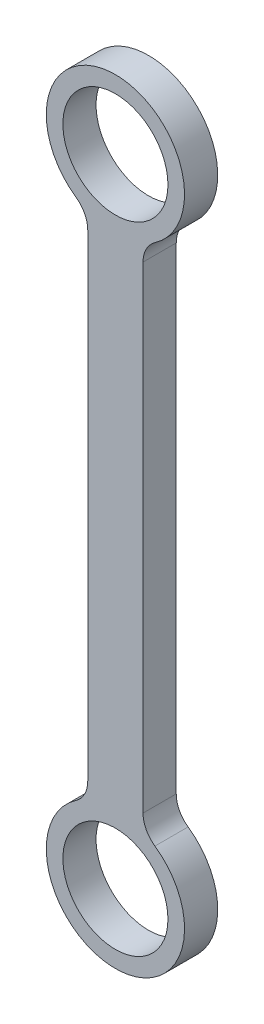
ISO-10303-21;
HEADER;
FILE_DESCRIPTION(('STEP AP214'),'2;1');
FILE_NAME('part.step','',(''),(''),'','','');
FILE_SCHEMA(('AUTOMOTIVE_DESIGN { 1 0 10303 214 1 1 1 1 }'));
ENDSEC;
DATA;
#1=APPLICATION_CONTEXT('core data for automotive mechanical design processes');
#2=APPLICATION_PROTOCOL_DEFINITION('international standard','automotive_design',2000,#1);
#3=PRODUCT_CONTEXT('',#1,'mechanical');
#4=PRODUCT('Part','Part','',(#3));
#5=PRODUCT_RELATED_PRODUCT_CATEGORY('part','',(#4));
#6=PRODUCT_DEFINITION_FORMATION('','',#4);
#7=PRODUCT_DEFINITION_CONTEXT('part definition',#1,'design');
#8=PRODUCT_DEFINITION('design','',#6,#7);
#9=PRODUCT_DEFINITION_SHAPE('','',#8);
#10=(LENGTH_UNIT() NAMED_UNIT(*) SI_UNIT(.MILLI.,.METRE.));
#11=(NAMED_UNIT(*) PLANE_ANGLE_UNIT() SI_UNIT($,.RADIAN.));
#12=(NAMED_UNIT(*) SI_UNIT($,.STERADIAN.) SOLID_ANGLE_UNIT());
#13=UNCERTAINTY_MEASURE_WITH_UNIT(LENGTH_MEASURE(1.E-05),#10,'distance_accuracy_value','');
#14=(GEOMETRIC_REPRESENTATION_CONTEXT(3) GLOBAL_UNCERTAINTY_ASSIGNED_CONTEXT((#13)) GLOBAL_UNIT_ASSIGNED_CONTEXT((#10,
#11,#12)) REPRESENTATION_CONTEXT('',''));
#15=CARTESIAN_POINT('',(0.,0.,0.));
#16=DIRECTION('',(0.,0.,1.));
#17=DIRECTION('',(1.,0.,0.));
#18=AXIS2_PLACEMENT_3D('',#15,#16,#17);
#19=CARTESIAN_POINT('',(0.,0.,6.));
#20=DIRECTION('',(0.,0.,-1.));
#21=DIRECTION('',(-1.,0.,0.));
#22=AXIS2_PLACEMENT_3D('',#19,#20,#21);
#23=CYLINDRICAL_SURFACE('',#22,12.5);
#24=CARTESIAN_POINT('',(0.,0.,0.));
#25=DIRECTION('',(0.,0.,1.));
#26=DIRECTION('',(1.,0.,0.));
#27=AXIS2_PLACEMENT_3D('',#24,#25,#26);
#28=CIRCLE('',#27,12.5);
#29=CARTESIAN_POINT('',(-7.14285714285714,10.2581475831036,0.));
#30=VERTEX_POINT('',#29);
#31=CARTESIAN_POINT('',(7.14285714285714,10.2581475831036,0.));
#32=VERTEX_POINT('',#31);
#33=EDGE_CURVE('E126',#30,#32,#28,.T.);
#34=ORIENTED_EDGE('',*,*,#33,.T.);
#35=DIRECTION('',(0.,0.,-1.));
#36=VECTOR('',#35,1.);
#37=CARTESIAN_POINT('',(7.14285714285714,10.2581475831036,6.));
#38=LINE('',#37,#36);
#39=CARTESIAN_POINT('',(7.14285714285714,10.2581475831036,6.));
#40=VERTEX_POINT('',#39);
#41=EDGE_CURVE('E105',#32,#40,#38,.F.);
#42=ORIENTED_EDGE('',*,*,#41,.T.);
#43=CARTESIAN_POINT('',(0.,0.,6.));
#44=DIRECTION('',(0.,0.,1.));
#45=DIRECTION('',(1.,0.,0.));
#46=AXIS2_PLACEMENT_3D('',#43,#44,#45);
#47=CIRCLE('',#46,12.5);
#48=CARTESIAN_POINT('',(-7.14285714285714,10.2581475831036,6.));
#49=VERTEX_POINT('',#48);
#50=EDGE_CURVE('E141',#49,#40,#47,.T.);
#51=ORIENTED_EDGE('',*,*,#50,.F.);
#52=DIRECTION('',(0.,0.,-1.));
#53=VECTOR('',#52,1.);
#54=CARTESIAN_POINT('',(-7.14285714285714,10.2581475831036,6.));
#55=LINE('',#54,#53);
#56=EDGE_CURVE('E119',#49,#30,#55,.T.);
#57=ORIENTED_EDGE('',*,*,#56,.T.);
#58=EDGE_LOOP('',(#34,#42,#51,#57));
#59=FACE_BOUND('',#58,.T.);
#60=ADVANCED_FACE('F35',(#59),#23,.T.);
#61=CARTESIAN_POINT('',(5.,0.,6.));
#62=DIRECTION('',(-1.,0.,0.));
#63=DIRECTION('',(0.,0.,1.));
#64=AXIS2_PLACEMENT_3D('',#61,#62,#63);
#65=PLANE('',#64);
#66=DIRECTION('',(0.,1.,0.));
#67=VECTOR('',#66,1.);
#68=CARTESIAN_POINT('',(5.,0.,6.));
#69=LINE('',#68,#67);
#70=CARTESIAN_POINT('',(5.,14.3614066163451,6.));
#71=VERTEX_POINT('',#70);
#72=CARTESIAN_POINT('',(5.,100.638593383655,6.));
#73=VERTEX_POINT('',#72);
#74=EDGE_CURVE('E118',#71,#73,#69,.T.);
#75=ORIENTED_EDGE('',*,*,#74,.F.);
#76=DIRECTION('',(0.,0.,1.));
#77=VECTOR('',#76,1.);
#78=CARTESIAN_POINT('',(5.,14.3614066163451,0.));
#79=LINE('',#78,#77);
#80=CARTESIAN_POINT('',(5.,14.3614066163451,0.));
#81=VERTEX_POINT('',#80);
#82=EDGE_CURVE('E104',#71,#81,#79,.F.);
#83=ORIENTED_EDGE('',*,*,#82,.T.);
#84=DIRECTION('',(0.,1.,0.));
#85=VECTOR('',#84,1.);
#86=CARTESIAN_POINT('',(5.,0.,0.));
#87=LINE('',#86,#85);
#88=CARTESIAN_POINT('',(5.,100.638593383655,0.));
#89=VERTEX_POINT('',#88);
#90=EDGE_CURVE('E116',#81,#89,#87,.T.);
#91=ORIENTED_EDGE('',*,*,#90,.T.);
#92=DIRECTION('',(0.,0.,1.));
#93=VECTOR('',#92,1.);
#94=CARTESIAN_POINT('',(5.,100.638593383655,6.));
#95=LINE('',#94,#93);
#96=EDGE_CURVE('E120',#89,#73,#95,.T.);
#97=ORIENTED_EDGE('',*,*,#96,.T.);
#98=EDGE_LOOP('',(#75,#83,#91,#97));
#99=FACE_BOUND('',#98,.T.);
#100=ADVANCED_FACE('F115',(#99),#65,.F.);
#101=CARTESIAN_POINT('',(0.,115.,6.));
#102=DIRECTION('',(0.,0.,-1.));
#103=DIRECTION('',(-1.,0.,0.));
#104=AXIS2_PLACEMENT_3D('',#101,#102,#103);
#105=CYLINDRICAL_SURFACE('',#104,12.5);
#106=CARTESIAN_POINT('',(0.,115.,0.));
#107=DIRECTION('',(0.,0.,1.));
#108=DIRECTION('',(1.,0.,0.));
#109=AXIS2_PLACEMENT_3D('',#106,#107,#108);
#110=CIRCLE('',#109,12.5);
#111=CARTESIAN_POINT('',(7.14285714285715,104.741852416896,0.));
#112=VERTEX_POINT('',#111);
#113=CARTESIAN_POINT('',(-7.14285714285715,104.741852416896,0.));
#114=VERTEX_POINT('',#113);
#115=EDGE_CURVE('E125',#112,#114,#110,.T.);
#116=ORIENTED_EDGE('',*,*,#115,.T.);
#117=DIRECTION('',(0.,0.,-1.));
#118=VECTOR('',#117,1.);
#119=CARTESIAN_POINT('',(-7.14285714285714,104.741852416896,6.));
#120=LINE('',#119,#118);
#121=CARTESIAN_POINT('',(-7.14285714285715,104.741852416896,6.));
#122=VERTEX_POINT('',#121);
#123=EDGE_CURVE('E50',#114,#122,#120,.F.);
#124=ORIENTED_EDGE('',*,*,#123,.T.);
#125=CARTESIAN_POINT('',(0.,115.,6.));
#126=DIRECTION('',(0.,0.,1.));
#127=DIRECTION('',(1.,0.,0.));
#128=AXIS2_PLACEMENT_3D('',#125,#126,#127);
#129=CIRCLE('',#128,12.5);
#130=CARTESIAN_POINT('',(7.14285714285715,104.741852416896,6.));
#131=VERTEX_POINT('',#130);
#132=EDGE_CURVE('E171',#131,#122,#129,.T.);
#133=ORIENTED_EDGE('',*,*,#132,.F.);
#134=DIRECTION('',(0.,0.,-1.));
#135=VECTOR('',#134,1.);
#136=CARTESIAN_POINT('',(7.14285714285715,104.741852416896,6.));
#137=LINE('',#136,#135);
#138=EDGE_CURVE('E152',#131,#112,#137,.T.);
#139=ORIENTED_EDGE('',*,*,#138,.T.);
#140=EDGE_LOOP('',(#116,#124,#133,#139));
#141=FACE_BOUND('',#140,.T.);
#142=ADVANCED_FACE('F181',(#141),#105,.T.);
#143=CARTESIAN_POINT('',(0.,115.,6.));
#144=DIRECTION('',(0.,0.,-1.));
#145=DIRECTION('',(-1.,0.,0.));
#146=AXIS2_PLACEMENT_3D('',#143,#144,#145);
#147=CYLINDRICAL_SURFACE('',#146,9.5);
#148=CARTESIAN_POINT('',(0.,115.,6.));
#149=DIRECTION('',(0.,0.,1.));
#150=DIRECTION('',(1.,0.,0.));
#151=AXIS2_PLACEMENT_3D('',#148,#149,#150);
#152=CIRCLE('',#151,9.5);
#153=CARTESIAN_POINT('',(9.5,115.,6.));
#154=VERTEX_POINT('',#153);
#155=EDGE_CURVE('E178',#154,#154,#152,.T.);
#156=ORIENTED_EDGE('',*,*,#155,.T.);
#157=EDGE_LOOP('',(#156));
#158=FACE_BOUND('',#157,.T.);
#159=CARTESIAN_POINT('',(0.,115.,0.));
#160=DIRECTION('',(0.,0.,1.));
#161=DIRECTION('',(1.,0.,0.));
#162=AXIS2_PLACEMENT_3D('',#159,#160,#161);
#163=CIRCLE('',#162,9.5);
#164=CARTESIAN_POINT('',(9.5,115.,0.));
#165=VERTEX_POINT('',#164);
#166=EDGE_CURVE('E135',#165,#165,#163,.T.);
#167=ORIENTED_EDGE('',*,*,#166,.F.);
#168=EDGE_LOOP('',(#167));
#169=FACE_BOUND('',#168,.T.);
#170=ADVANCED_FACE('F262',(#158,#169),#147,.F.);
#171=CARTESIAN_POINT('',(-5.,0.,6.));
#172=DIRECTION('',(-1.,0.,0.));
#173=DIRECTION('',(0.,0.,1.));
#174=AXIS2_PLACEMENT_3D('',#171,#172,#173);
#175=PLANE('',#174);
#176=DIRECTION('',(0.,1.,0.));
#177=VECTOR('',#176,1.);
#178=CARTESIAN_POINT('',(-5.,0.,0.));
#179=LINE('',#178,#177);
#180=CARTESIAN_POINT('',(-5.,14.3614066163451,0.));
#181=VERTEX_POINT('',#180);
#182=CARTESIAN_POINT('',(-5.,100.638593383655,0.));
#183=VERTEX_POINT('',#182);
#184=EDGE_CURVE('E128',#181,#183,#179,.T.);
#185=ORIENTED_EDGE('',*,*,#184,.F.);
#186=DIRECTION('',(0.,0.,-1.));
#187=VECTOR('',#186,1.);
#188=CARTESIAN_POINT('',(-5.,14.3614066163451,6.));
#189=LINE('',#188,#187);
#190=CARTESIAN_POINT('',(-5.,14.3614066163451,6.));
#191=VERTEX_POINT('',#190);
#192=EDGE_CURVE('E150',#181,#191,#189,.F.);
#193=ORIENTED_EDGE('',*,*,#192,.T.);
#194=DIRECTION('',(0.,1.,0.));
#195=VECTOR('',#194,1.);
#196=CARTESIAN_POINT('',(-5.,0.,6.));
#197=LINE('',#196,#195);
#198=CARTESIAN_POINT('',(-5.,100.638593383655,6.));
#199=VERTEX_POINT('',#198);
#200=EDGE_CURVE('E169',#191,#199,#197,.T.);
#201=ORIENTED_EDGE('',*,*,#200,.T.);
#202=DIRECTION('',(0.,0.,-1.));
#203=VECTOR('',#202,1.);
#204=CARTESIAN_POINT('',(-5.,100.638593383655,6.));
#205=LINE('',#204,#203);
#206=EDGE_CURVE('E147',#199,#183,#205,.T.);
#207=ORIENTED_EDGE('',*,*,#206,.T.);
#208=EDGE_LOOP('',(#185,#193,#201,#207));
#209=FACE_BOUND('',#208,.T.);
#210=ADVANCED_FACE('F176',(#209),#175,.T.);
#211=CARTESIAN_POINT('',(0.,0.,6.));
#212=DIRECTION('',(0.,0.,-1.));
#213=DIRECTION('',(-1.,0.,0.));
#214=AXIS2_PLACEMENT_3D('',#211,#212,#213);
#215=CYLINDRICAL_SURFACE('',#214,9.5);
#216=CARTESIAN_POINT('',(0.,0.,6.));
#217=DIRECTION('',(0.,0.,1.));
#218=DIRECTION('',(1.,0.,0.));
#219=AXIS2_PLACEMENT_3D('',#216,#217,#218);
#220=CIRCLE('',#219,9.5);
#221=CARTESIAN_POINT('',(9.5,0.,6.));
#222=VERTEX_POINT('',#221);
#223=EDGE_CURVE('E142',#222,#222,#220,.T.);
#224=ORIENTED_EDGE('',*,*,#223,.T.);
#225=EDGE_LOOP('',(#224));
#226=FACE_BOUND('',#225,.T.);
#227=CARTESIAN_POINT('',(0.,0.,0.));
#228=DIRECTION('',(0.,0.,1.));
#229=DIRECTION('',(1.,0.,0.));
#230=AXIS2_PLACEMENT_3D('',#227,#228,#229);
#231=CIRCLE('',#230,9.5);
#232=CARTESIAN_POINT('',(9.5,0.,0.));
#233=VERTEX_POINT('',#232);
#234=EDGE_CURVE('E138',#233,#233,#231,.T.);
#235=ORIENTED_EDGE('',*,*,#234,.F.);
#236=EDGE_LOOP('',(#235));
#237=FACE_BOUND('',#236,.T.);
#238=ADVANCED_FACE('F193',(#226,#237),#215,.F.);
#239=CARTESIAN_POINT('',(0.,0.,6.));
#240=DIRECTION('',(0.,0.,1.));
#241=DIRECTION('',(1.,0.,0.));
#242=AXIS2_PLACEMENT_3D('',#239,#240,#241);
#243=PLANE('',#242);
#244=ORIENTED_EDGE('',*,*,#200,.F.);
#245=CARTESIAN_POINT('',(-10.,14.3614066163451,6.));
#246=DIRECTION('',(0.,0.,1.));
#247=DIRECTION('',(1.,0.,0.));
#248=AXIS2_PLACEMENT_3D('',#245,#246,#247);
#249=CIRCLE('',#248,5.);
#250=EDGE_CURVE('E159',#191,#49,#249,.F.);
#251=ORIENTED_EDGE('',*,*,#250,.T.);
#252=ORIENTED_EDGE('',*,*,#50,.T.);
#253=CARTESIAN_POINT('',(10.,14.3614066163451,6.));
#254=DIRECTION('',(0.,0.,1.));
#255=DIRECTION('',(1.,0.,0.));
#256=AXIS2_PLACEMENT_3D('',#253,#254,#255);
#257=CIRCLE('',#256,5.);
#258=EDGE_CURVE('E110',#40,#71,#257,.F.);
#259=ORIENTED_EDGE('',*,*,#258,.T.);
#260=ORIENTED_EDGE('',*,*,#74,.T.);
#261=CARTESIAN_POINT('',(10.,100.638593383655,6.));
#262=DIRECTION('',(0.,0.,1.));
#263=DIRECTION('',(1.,0.,0.));
#264=AXIS2_PLACEMENT_3D('',#261,#262,#263);
#265=CIRCLE('',#264,5.);
#266=EDGE_CURVE('E11',#73,#131,#265,.F.);
#267=ORIENTED_EDGE('',*,*,#266,.T.);
#268=ORIENTED_EDGE('',*,*,#132,.T.);
#269=CARTESIAN_POINT('',(-10.,100.638593383655,6.));
#270=DIRECTION('',(0.,0.,1.));
#271=DIRECTION('',(1.,0.,0.));
#272=AXIS2_PLACEMENT_3D('',#269,#270,#271);
#273=CIRCLE('',#272,5.);
#274=EDGE_CURVE('E163',#122,#199,#273,.F.);
#275=ORIENTED_EDGE('',*,*,#274,.T.);
#276=EDGE_LOOP('',(#244,#251,#252,#259,#260,#267,#268,#275));
#277=FACE_BOUND('',#276,.T.);
#278=ORIENTED_EDGE('',*,*,#155,.F.);
#279=EDGE_LOOP('',(#278));
#280=FACE_BOUND('',#279,.T.);
#281=ORIENTED_EDGE('',*,*,#223,.F.);
#282=EDGE_LOOP('',(#281));
#283=FACE_BOUND('',#282,.T.);
#284=ADVANCED_FACE('F167',(#277,#280,#283),#243,.T.);
#285=CARTESIAN_POINT('',(0.,0.,0.));
#286=DIRECTION('',(0.,0.,1.));
#287=DIRECTION('',(1.,0.,0.));
#288=AXIS2_PLACEMENT_3D('',#285,#286,#287);
#289=PLANE('',#288);
#290=ORIENTED_EDGE('',*,*,#33,.F.);
#291=CARTESIAN_POINT('',(-10.,14.3614066163451,0.));
#292=DIRECTION('',(0.,0.,1.));
#293=DIRECTION('',(1.,0.,0.));
#294=AXIS2_PLACEMENT_3D('',#291,#292,#293);
#295=CIRCLE('',#294,5.);
#296=EDGE_CURVE('E157',#30,#181,#295,.T.);
#297=ORIENTED_EDGE('',*,*,#296,.T.);
#298=ORIENTED_EDGE('',*,*,#184,.T.);
#299=CARTESIAN_POINT('',(-10.,100.638593383655,0.));
#300=DIRECTION('',(0.,0.,1.));
#301=DIRECTION('',(1.,0.,0.));
#302=AXIS2_PLACEMENT_3D('',#299,#300,#301);
#303=CIRCLE('',#302,5.);
#304=EDGE_CURVE('E161',#183,#114,#303,.T.);
#305=ORIENTED_EDGE('',*,*,#304,.T.);
#306=ORIENTED_EDGE('',*,*,#115,.F.);
#307=CARTESIAN_POINT('',(10.,100.638593383655,0.));
#308=DIRECTION('',(0.,0.,1.));
#309=DIRECTION('',(1.,0.,0.));
#310=AXIS2_PLACEMENT_3D('',#307,#308,#309);
#311=CIRCLE('',#310,5.);
#312=EDGE_CURVE('E43',#112,#89,#311,.T.);
#313=ORIENTED_EDGE('',*,*,#312,.T.);
#314=ORIENTED_EDGE('',*,*,#90,.F.);
#315=CARTESIAN_POINT('',(10.,14.3614066163451,0.));
#316=DIRECTION('',(0.,0.,1.));
#317=DIRECTION('',(1.,0.,0.));
#318=AXIS2_PLACEMENT_3D('',#315,#316,#317);
#319=CIRCLE('',#318,5.);
#320=EDGE_CURVE('E100',#81,#32,#319,.T.);
#321=ORIENTED_EDGE('',*,*,#320,.T.);
#322=EDGE_LOOP('',(#290,#297,#298,#305,#306,#313,#314,#321));
#323=FACE_BOUND('',#322,.T.);
#324=ORIENTED_EDGE('',*,*,#166,.T.);
#325=EDGE_LOOP('',(#324));
#326=FACE_BOUND('',#325,.T.);
#327=ORIENTED_EDGE('',*,*,#234,.T.);
#328=EDGE_LOOP('',(#327));
#329=FACE_BOUND('',#328,.T.);
#330=ADVANCED_FACE('F122',(#323,#326,#329),#289,.F.);
#331=CARTESIAN_POINT('',(10.,14.3614066163451,6.));
#332=DIRECTION('',(0.,0.,-1.));
#333=DIRECTION('',(-1.,0.,0.));
#334=AXIS2_PLACEMENT_3D('',#331,#332,#333);
#335=CYLINDRICAL_SURFACE('',#334,5.);
#336=ORIENTED_EDGE('',*,*,#258,.F.);
#337=ORIENTED_EDGE('',*,*,#41,.F.);
#338=ORIENTED_EDGE('',*,*,#320,.F.);
#339=ORIENTED_EDGE('',*,*,#82,.F.);
#340=EDGE_LOOP('',(#336,#337,#338,#339));
#341=FACE_BOUND('',#340,.T.);
#342=ADVANCED_FACE('F103',(#341),#335,.F.);
#343=CARTESIAN_POINT('',(-10.,14.3614066163451,6.));
#344=DIRECTION('',(0.,0.,-1.));
#345=DIRECTION('',(-1.,0.,0.));
#346=AXIS2_PLACEMENT_3D('',#343,#344,#345);
#347=CYLINDRICAL_SURFACE('',#346,5.);
#348=ORIENTED_EDGE('',*,*,#250,.F.);
#349=ORIENTED_EDGE('',*,*,#192,.F.);
#350=ORIENTED_EDGE('',*,*,#296,.F.);
#351=ORIENTED_EDGE('',*,*,#56,.F.);
#352=EDGE_LOOP('',(#348,#349,#350,#351));
#353=FACE_BOUND('',#352,.T.);
#354=ADVANCED_FACE('F215',(#353),#347,.F.);
#355=CARTESIAN_POINT('',(-10.,100.638593383655,6.));
#356=DIRECTION('',(0.,0.,-1.));
#357=DIRECTION('',(-1.,0.,0.));
#358=AXIS2_PLACEMENT_3D('',#355,#356,#357);
#359=CYLINDRICAL_SURFACE('',#358,5.);
#360=ORIENTED_EDGE('',*,*,#274,.F.);
#361=ORIENTED_EDGE('',*,*,#123,.F.);
#362=ORIENTED_EDGE('',*,*,#304,.F.);
#363=ORIENTED_EDGE('',*,*,#206,.F.);
#364=EDGE_LOOP('',(#360,#361,#362,#363));
#365=FACE_BOUND('',#364,.T.);
#366=ADVANCED_FACE('F180',(#365),#359,.F.);
#367=CARTESIAN_POINT('',(10.,100.638593383655,6.));
#368=DIRECTION('',(0.,0.,-1.));
#369=DIRECTION('',(-1.,0.,0.));
#370=AXIS2_PLACEMENT_3D('',#367,#368,#369);
#371=CYLINDRICAL_SURFACE('',#370,5.);
#372=ORIENTED_EDGE('',*,*,#266,.F.);
#373=ORIENTED_EDGE('',*,*,#96,.F.);
#374=ORIENTED_EDGE('',*,*,#312,.F.);
#375=ORIENTED_EDGE('',*,*,#138,.F.);
#376=EDGE_LOOP('',(#372,#373,#374,#375));
#377=FACE_BOUND('',#376,.T.);
#378=ADVANCED_FACE('F37',(#377),#371,.F.);
#379=CLOSED_SHELL('',(#60,#100,#142,#170,#210,#238,#284,#330,#342,#354,#366,#378));
#380=MANIFOLD_SOLID_BREP('B2',#379);
#381=ADVANCED_BREP_SHAPE_REPRESENTATION('',(#18,#380),#14);
#382=SHAPE_DEFINITION_REPRESENTATION(#9,#381);
ENDSEC;
END-ISO-10303-21;
